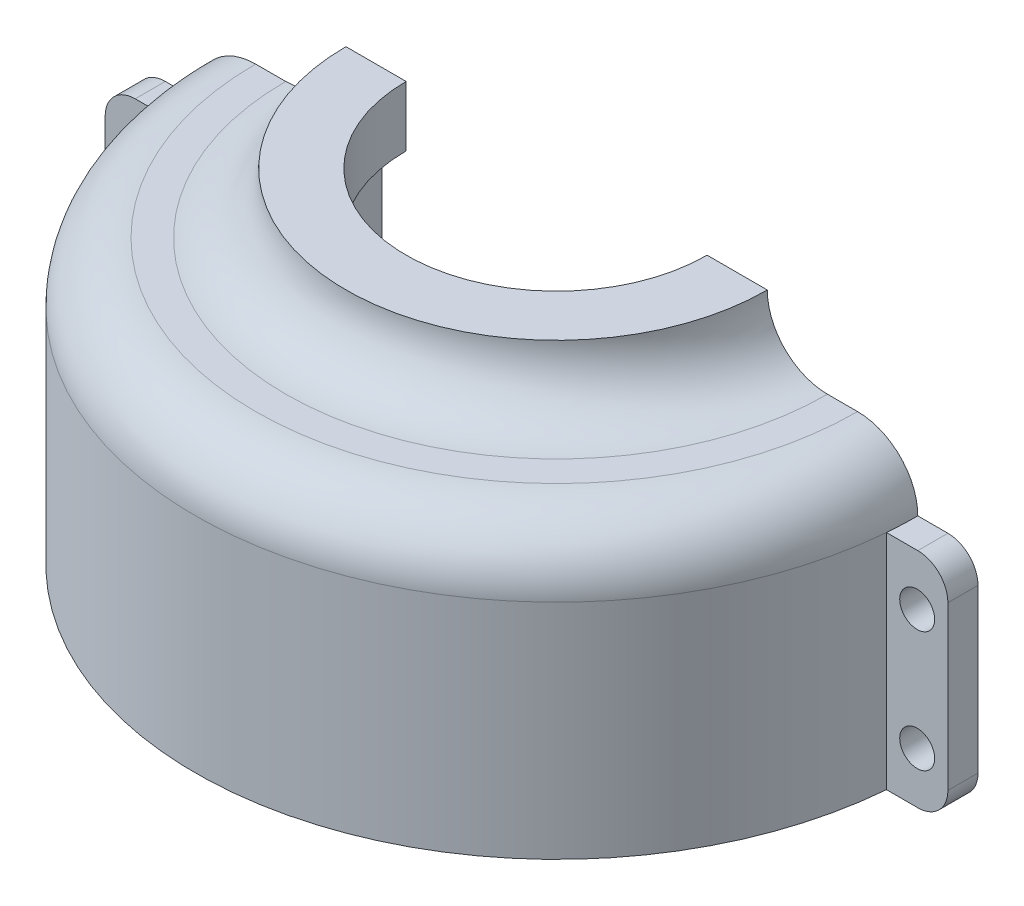
ISO-10303-21;
HEADER;
FILE_DESCRIPTION(('STEP AP214'),'2;1');
FILE_NAME('part.step','',(''),(''),'','','');
FILE_SCHEMA(('AUTOMOTIVE_DESIGN { 1 0 10303 214 1 1 1 1 }'));
ENDSEC;
DATA;
#1=APPLICATION_CONTEXT('core data for automotive mechanical design processes');
#2=APPLICATION_PROTOCOL_DEFINITION('international standard','automotive_design',2000,#1);
#3=PRODUCT_CONTEXT('',#1,'mechanical');
#4=PRODUCT('Part','Part','',(#3));
#5=PRODUCT_RELATED_PRODUCT_CATEGORY('part','',(#4));
#6=PRODUCT_DEFINITION_FORMATION('','',#4);
#7=PRODUCT_DEFINITION_CONTEXT('part definition',#1,'design');
#8=PRODUCT_DEFINITION('design','',#6,#7);
#9=PRODUCT_DEFINITION_SHAPE('','',#8);
#10=(LENGTH_UNIT() NAMED_UNIT(*) SI_UNIT(.MILLI.,.METRE.));
#11=(NAMED_UNIT(*) PLANE_ANGLE_UNIT() SI_UNIT($,.RADIAN.));
#12=(NAMED_UNIT(*) SI_UNIT($,.STERADIAN.) SOLID_ANGLE_UNIT());
#13=UNCERTAINTY_MEASURE_WITH_UNIT(LENGTH_MEASURE(1.E-05),#10,'distance_accuracy_value','');
#14=(GEOMETRIC_REPRESENTATION_CONTEXT(3) GLOBAL_UNCERTAINTY_ASSIGNED_CONTEXT((#13)) GLOBAL_UNIT_ASSIGNED_CONTEXT((#10,
#11,#12)) REPRESENTATION_CONTEXT('',''));
#15=CARTESIAN_POINT('',(0.,0.,0.));
#16=DIRECTION('',(0.,0.,1.));
#17=DIRECTION('',(1.,0.,0.));
#18=AXIS2_PLACEMENT_3D('',#15,#16,#17);
#19=CARTESIAN_POINT('',(0.,0.,0.));
#20=DIRECTION('',(0.,0.,1.));
#21=DIRECTION('',(1.,0.,0.));
#22=AXIS2_PLACEMENT_3D('',#19,#20,#21);
#23=PLANE('',#22);
#24=CARTESIAN_POINT('',(-64.8956518577535,8.49999999999998,0.));
#25=DIRECTION('',(0.,0.,1.));
#26=DIRECTION('',(1.,0.,0.));
#27=AXIS2_PLACEMENT_3D('',#24,#25,#26);
#28=CIRCLE('',#27,2.9);
#29=CARTESIAN_POINT('',(-61.9956518577535,8.49999999999998,0.));
#30=VERTEX_POINT('',#29);
#31=EDGE_CURVE('E302',#30,#30,#28,.F.);
#32=ORIENTED_EDGE('',*,*,#31,.F.);
#33=EDGE_LOOP('',(#32));
#34=FACE_BOUND('',#33,.T.);
#35=DIRECTION('',(1.,0.,0.));
#36=VECTOR('',#35,1.);
#37=CARTESIAN_POINT('',(0.,5.,0.));
#38=LINE('',#37,#36);
#39=CARTESIAN_POINT('',(-55.,5.,0.));
#40=VERTEX_POINT('',#39);
#41=CARTESIAN_POINT('',(-20.,5.,0.));
#42=VERTEX_POINT('',#41);
#43=EDGE_CURVE('E326',#40,#42,#38,.T.);
#44=ORIENTED_EDGE('',*,*,#43,.T.);
#45=DIRECTION('',(0.,-1.,0.));
#46=VECTOR('',#45,1.);
#47=CARTESIAN_POINT('',(-20.,5.,0.));
#48=LINE('',#47,#46);
#49=CARTESIAN_POINT('',(-20.,0.,0.));
#50=VERTEX_POINT('',#49);
#51=EDGE_CURVE('E344',#42,#50,#48,.T.);
#52=ORIENTED_EDGE('',*,*,#51,.T.);
#53=DIRECTION('',(1.,0.,0.));
#54=VECTOR('',#53,1.);
#55=CARTESIAN_POINT('',(0.,0.,0.));
#56=LINE('',#55,#54);
#57=CARTESIAN_POINT('',(-65.,0.,0.));
#58=VERTEX_POINT('',#57);
#59=EDGE_CURVE('E324',#58,#50,#56,.T.);
#60=ORIENTED_EDGE('',*,*,#59,.F.);
#61=CARTESIAN_POINT('',(-65.,5.,0.));
#62=DIRECTION('',(0.,0.,1.));
#63=DIRECTION('',(1.,0.,0.));
#64=AXIS2_PLACEMENT_3D('',#61,#62,#63);
#65=CIRCLE('',#64,5.);
#66=CARTESIAN_POINT('',(-70.,5.,0.));
#67=VERTEX_POINT('',#66);
#68=EDGE_CURVE('E354',#58,#67,#65,.F.);
#69=ORIENTED_EDGE('',*,*,#68,.T.);
#70=DIRECTION('',(0.,-1.,0.));
#71=VECTOR('',#70,1.);
#72=CARTESIAN_POINT('',(-70.,0.,0.));
#73=LINE('',#72,#71);
#74=CARTESIAN_POINT('',(-70.,32.,0.));
#75=VERTEX_POINT('',#74);
#76=EDGE_CURVE('E358',#75,#67,#73,.T.);
#77=ORIENTED_EDGE('',*,*,#76,.F.);
#78=CARTESIAN_POINT('',(-65.,32.,0.));
#79=DIRECTION('',(0.,0.,1.));
#80=DIRECTION('',(1.,0.,0.));
#81=AXIS2_PLACEMENT_3D('',#78,#79,#80);
#82=CIRCLE('',#81,5.);
#83=CARTESIAN_POINT('',(-65.,37.,0.));
#84=VERTEX_POINT('',#83);
#85=EDGE_CURVE('E300',#75,#84,#82,.F.);
#86=ORIENTED_EDGE('',*,*,#85,.T.);
#87=DIRECTION('',(1.,0.,0.));
#88=VECTOR('',#87,1.);
#89=CARTESIAN_POINT('',(60.001,37.,0.));
#90=LINE('',#89,#88);
#91=CARTESIAN_POINT('',(-60.,37.,0.));
#92=VERTEX_POINT('',#91);
#93=EDGE_CURVE('E355',#84,#92,#90,.T.);
#94=ORIENTED_EDGE('',*,*,#93,.T.);
#95=CARTESIAN_POINT('',(-50.,37.,0.));
#96=DIRECTION('',(0.,0.,1.));
#97=DIRECTION('',(1.,0.,0.));
#98=AXIS2_PLACEMENT_3D('',#95,#96,#97);
#99=CIRCLE('',#98,10.);
#100=CARTESIAN_POINT('',(-50.,47.,0.));
#101=VERTEX_POINT('',#100);
#102=EDGE_CURVE('E306',#92,#101,#99,.F.);
#103=ORIENTED_EDGE('',*,*,#102,.T.);
#104=DIRECTION('',(1.,0.,0.));
#105=VECTOR('',#104,1.);
#106=CARTESIAN_POINT('',(0.,47.,0.));
#107=LINE('',#106,#105);
#108=CARTESIAN_POINT('',(-45.,47.,0.));
#109=VERTEX_POINT('',#108);
#110=EDGE_CURVE('E312',#101,#109,#107,.T.);
#111=ORIENTED_EDGE('',*,*,#110,.T.);
#112=CARTESIAN_POINT('',(-45.,57.,0.));
#113=DIRECTION('',(0.,0.,1.));
#114=DIRECTION('',(1.,0.,0.));
#115=AXIS2_PLACEMENT_3D('',#112,#113,#114);
#116=CIRCLE('',#115,10.);
#117=CARTESIAN_POINT('',(-35.,57.,0.));
#118=VERTEX_POINT('',#117);
#119=EDGE_CURVE('E318',#118,#109,#116,.F.);
#120=ORIENTED_EDGE('',*,*,#119,.F.);
#121=DIRECTION('',(1.,0.,0.));
#122=VECTOR('',#121,1.);
#123=CARTESIAN_POINT('',(0.,57.,0.));
#124=LINE('',#123,#122);
#125=CARTESIAN_POINT('',(-25.,57.,0.));
#126=VERTEX_POINT('',#125);
#127=EDGE_CURVE('E323',#118,#126,#124,.T.);
#128=ORIENTED_EDGE('',*,*,#127,.T.);
#129=DIRECTION('',(0.,-1.,0.));
#130=VECTOR('',#129,1.);
#131=CARTESIAN_POINT('',(-25.,57.,0.));
#132=LINE('',#131,#130);
#133=CARTESIAN_POINT('',(-25.,47.,0.));
#134=VERTEX_POINT('',#133);
#135=EDGE_CURVE('E322',#126,#134,#132,.T.);
#136=ORIENTED_EDGE('',*,*,#135,.T.);
#137=DIRECTION('',(1.,0.,0.));
#138=VECTOR('',#137,1.);
#139=CARTESIAN_POINT('',(0.,47.,0.));
#140=LINE('',#139,#138);
#141=CARTESIAN_POINT('',(-29.,47.,0.));
#142=VERTEX_POINT('',#141);
#143=EDGE_CURVE('E330',#142,#134,#140,.T.);
#144=ORIENTED_EDGE('',*,*,#143,.F.);
#145=DIRECTION('',(0.,-1.,0.));
#146=VECTOR('',#145,1.);
#147=CARTESIAN_POINT('',(-29.,47.,0.));
#148=LINE('',#147,#146);
#149=CARTESIAN_POINT('',(-29.,22.,0.));
#150=VERTEX_POINT('',#149);
#151=EDGE_CURVE('E311',#142,#150,#148,.T.);
#152=ORIENTED_EDGE('',*,*,#151,.T.);
#153=DIRECTION('',(1.,0.,0.));
#154=VECTOR('',#153,1.);
#155=CARTESIAN_POINT('',(0.,22.,0.));
#156=LINE('',#155,#154);
#157=CARTESIAN_POINT('',(-55.,22.,0.));
#158=VERTEX_POINT('',#157);
#159=EDGE_CURVE('E336',#158,#150,#156,.T.);
#160=ORIENTED_EDGE('',*,*,#159,.F.);
#161=DIRECTION('',(0.,-1.,0.));
#162=VECTOR('',#161,1.);
#163=CARTESIAN_POINT('',(-55.,22.,0.));
#164=LINE('',#163,#162);
#165=EDGE_CURVE('E341',#158,#40,#164,.T.);
#166=ORIENTED_EDGE('',*,*,#165,.T.);
#167=EDGE_LOOP('',(#44,#52,#60,#69,#77,#86,#94,#103,#111,#120,#128,#136,#144,#152,#160,#166));
#168=FACE_BOUND('',#167,.T.);
#169=CARTESIAN_POINT('',(-64.8956518577535,28.5,0.));
#170=DIRECTION('',(0.,0.,1.));
#171=DIRECTION('',(1.,0.,0.));
#172=AXIS2_PLACEMENT_3D('',#169,#170,#171);
#173=CIRCLE('',#172,2.9);
#174=CARTESIAN_POINT('',(-61.9956518577535,28.5,0.));
#175=VERTEX_POINT('',#174);
#176=EDGE_CURVE('E37',#175,#175,#173,.F.);
#177=ORIENTED_EDGE('',*,*,#176,.F.);
#178=EDGE_LOOP('',(#177));
#179=FACE_BOUND('',#178,.T.);
#180=ADVANCED_FACE('F34',(#34,#168,#179),#23,.F.);
#181=CARTESIAN_POINT('',(64.8956518577535,8.49999999999998,0.));
#182=DIRECTION('',(0.,0.,1.));
#183=DIRECTION('',(1.,0.,0.));
#184=AXIS2_PLACEMENT_3D('',#181,#182,#183);
#185=CIRCLE('',#184,2.9);
#186=CARTESIAN_POINT('',(67.7956518577535,8.49999999999998,0.));
#187=VERTEX_POINT('',#186);
#188=EDGE_CURVE('E297',#187,#187,#185,.F.);
#189=ORIENTED_EDGE('',*,*,#188,.F.);
#190=EDGE_LOOP('',(#189));
#191=FACE_BOUND('',#190,.T.);
#192=CARTESIAN_POINT('',(20.,5.,0.));
#193=VERTEX_POINT('',#192);
#194=CARTESIAN_POINT('',(55.,5.,0.));
#195=VERTEX_POINT('',#194);
#196=EDGE_CURVE('E345',#193,#195,#38,.T.);
#197=ORIENTED_EDGE('',*,*,#196,.T.);
#198=DIRECTION('',(0.,-1.,0.));
#199=VECTOR('',#198,1.);
#200=CARTESIAN_POINT('',(55.,22.,0.));
#201=LINE('',#200,#199);
#202=CARTESIAN_POINT('',(55.,22.,0.));
#203=VERTEX_POINT('',#202);
#204=EDGE_CURVE('E338',#195,#203,#201,.F.);
#205=ORIENTED_EDGE('',*,*,#204,.T.);
#206=CARTESIAN_POINT('',(29.,22.,0.));
#207=VERTEX_POINT('',#206);
#208=EDGE_CURVE('E332',#207,#203,#156,.T.);
#209=ORIENTED_EDGE('',*,*,#208,.F.);
#210=DIRECTION('',(0.,-1.,0.));
#211=VECTOR('',#210,1.);
#212=CARTESIAN_POINT('',(29.,47.,0.));
#213=LINE('',#212,#211);
#214=CARTESIAN_POINT('',(29.,47.,0.));
#215=VERTEX_POINT('',#214);
#216=EDGE_CURVE('E333',#207,#215,#213,.F.);
#217=ORIENTED_EDGE('',*,*,#216,.T.);
#218=CARTESIAN_POINT('',(25.,47.,0.));
#219=VERTEX_POINT('',#218);
#220=EDGE_CURVE('E317',#219,#215,#140,.T.);
#221=ORIENTED_EDGE('',*,*,#220,.F.);
#222=DIRECTION('',(0.,-1.,0.));
#223=VECTOR('',#222,1.);
#224=CARTESIAN_POINT('',(25.,57.,0.));
#225=LINE('',#224,#223);
#226=CARTESIAN_POINT('',(25.,57.,0.));
#227=VERTEX_POINT('',#226);
#228=EDGE_CURVE('E307',#219,#227,#225,.F.);
#229=ORIENTED_EDGE('',*,*,#228,.T.);
#230=CARTESIAN_POINT('',(35.,57.,0.));
#231=VERTEX_POINT('',#230);
#232=EDGE_CURVE('E319',#227,#231,#124,.T.);
#233=ORIENTED_EDGE('',*,*,#232,.T.);
#234=CARTESIAN_POINT('',(45.,57.,0.));
#235=DIRECTION('',(0.,0.,1.));
#236=DIRECTION('',(1.,0.,0.));
#237=AXIS2_PLACEMENT_3D('',#234,#235,#236);
#238=CIRCLE('',#237,10.);
#239=CARTESIAN_POINT('',(45.,47.,0.));
#240=VERTEX_POINT('',#239);
#241=EDGE_CURVE('E315',#240,#231,#238,.F.);
#242=ORIENTED_EDGE('',*,*,#241,.F.);
#243=CARTESIAN_POINT('',(50.,47.,0.));
#244=VERTEX_POINT('',#243);
#245=EDGE_CURVE('E308',#240,#244,#107,.T.);
#246=ORIENTED_EDGE('',*,*,#245,.T.);
#247=CARTESIAN_POINT('',(50.,37.,0.));
#248=DIRECTION('',(0.,0.,1.));
#249=DIRECTION('',(1.,0.,0.));
#250=AXIS2_PLACEMENT_3D('',#247,#248,#249);
#251=CIRCLE('',#250,10.);
#252=CARTESIAN_POINT('',(60.,37.,0.));
#253=VERTEX_POINT('',#252);
#254=EDGE_CURVE('E304',#244,#253,#251,.F.);
#255=ORIENTED_EDGE('',*,*,#254,.T.);
#256=DIRECTION('',(1.,0.,0.));
#257=VECTOR('',#256,1.);
#258=CARTESIAN_POINT('',(-60.001,37.,0.));
#259=LINE('',#258,#257);
#260=CARTESIAN_POINT('',(65.,37.,0.));
#261=VERTEX_POINT('',#260);
#262=EDGE_CURVE('E217',#253,#261,#259,.T.);
#263=ORIENTED_EDGE('',*,*,#262,.T.);
#264=CARTESIAN_POINT('',(65.,32.,0.));
#265=DIRECTION('',(0.,0.,1.));
#266=DIRECTION('',(1.,0.,0.));
#267=AXIS2_PLACEMENT_3D('',#264,#265,#266);
#268=CIRCLE('',#267,5.);
#269=CARTESIAN_POINT('',(70.,32.,0.));
#270=VERTEX_POINT('',#269);
#271=EDGE_CURVE('E12',#261,#270,#268,.F.);
#272=ORIENTED_EDGE('',*,*,#271,.T.);
#273=DIRECTION('',(0.,1.,0.));
#274=VECTOR('',#273,1.);
#275=CARTESIAN_POINT('',(70.,0.,0.));
#276=LINE('',#275,#274);
#277=CARTESIAN_POINT('',(70.,5.,0.));
#278=VERTEX_POINT('',#277);
#279=EDGE_CURVE('E50',#278,#270,#276,.T.);
#280=ORIENTED_EDGE('',*,*,#279,.F.);
#281=CARTESIAN_POINT('',(65.,5.,0.));
#282=DIRECTION('',(0.,0.,1.));
#283=DIRECTION('',(1.,0.,0.));
#284=AXIS2_PLACEMENT_3D('',#281,#282,#283);
#285=CIRCLE('',#284,5.);
#286=CARTESIAN_POINT('',(65.,0.,0.));
#287=VERTEX_POINT('',#286);
#288=EDGE_CURVE('E42',#278,#287,#285,.F.);
#289=ORIENTED_EDGE('',*,*,#288,.T.);
#290=CARTESIAN_POINT('',(20.,0.,0.));
#291=VERTEX_POINT('',#290);
#292=EDGE_CURVE('E327',#291,#287,#56,.T.);
#293=ORIENTED_EDGE('',*,*,#292,.F.);
#294=DIRECTION('',(0.,-1.,0.));
#295=VECTOR('',#294,1.);
#296=CARTESIAN_POINT('',(20.,5.,0.));
#297=LINE('',#296,#295);
#298=EDGE_CURVE('E342',#291,#193,#297,.F.);
#299=ORIENTED_EDGE('',*,*,#298,.T.);
#300=EDGE_LOOP('',(#197,#205,#209,#217,#221,#229,#233,#242,#246,#255,#263,#272,#280,#289,#293,#299));
#301=FACE_BOUND('',#300,.T.);
#302=CARTESIAN_POINT('',(64.8956518577535,28.5,0.));
#303=DIRECTION('',(0.,0.,1.));
#304=DIRECTION('',(1.,0.,0.));
#305=AXIS2_PLACEMENT_3D('',#302,#303,#304);
#306=CIRCLE('',#305,2.9);
#307=CARTESIAN_POINT('',(67.7956518577535,28.5,0.));
#308=VERTEX_POINT('',#307);
#309=EDGE_CURVE('E303',#308,#308,#306,.F.);
#310=ORIENTED_EDGE('',*,*,#309,.F.);
#311=EDGE_LOOP('',(#310));
#312=FACE_BOUND('',#311,.T.);
#313=ADVANCED_FACE('F381',(#191,#301,#312),#23,.F.);
#314=CARTESIAN_POINT('',(0.,5.,0.));
#315=DIRECTION('',(0.,1.,0.));
#316=DIRECTION('',(0.,0.,1.));
#317=AXIS2_PLACEMENT_3D('',#314,#315,#316);
#318=PLANE('',#317);
#319=ORIENTED_EDGE('',*,*,#43,.F.);
#320=CARTESIAN_POINT('',(0.,5.,0.));
#321=DIRECTION('',(0.,1.,0.));
#322=DIRECTION('',(0.,0.,1.));
#323=AXIS2_PLACEMENT_3D('',#320,#321,#322);
#324=CIRCLE('',#323,55.);
#325=EDGE_CURVE('E274',#195,#40,#324,.F.);
#326=ORIENTED_EDGE('',*,*,#325,.F.);
#327=ORIENTED_EDGE('',*,*,#196,.F.);
#328=CARTESIAN_POINT('',(0.,5.,0.));
#329=DIRECTION('',(0.,1.,0.));
#330=DIRECTION('',(0.,0.,1.));
#331=AXIS2_PLACEMENT_3D('',#328,#329,#330);
#332=CIRCLE('',#331,20.);
#333=EDGE_CURVE('E271',#42,#193,#332,.T.);
#334=ORIENTED_EDGE('',*,*,#333,.F.);
#335=EDGE_LOOP('',(#319,#326,#327,#334));
#336=FACE_BOUND('',#335,.T.);
#337=ADVANCED_FACE('F386',(#336),#318,.T.);
#338=CARTESIAN_POINT('',(0.,0.,0.));
#339=DIRECTION('',(0.,1.,0.));
#340=DIRECTION('',(0.,0.,1.));
#341=AXIS2_PLACEMENT_3D('',#338,#339,#340);
#342=PLANE('',#341);
#343=DIRECTION('',(0.,0.,1.));
#344=VECTOR('',#343,1.);
#345=CARTESIAN_POINT('',(-65.,0.,0.));
#346=LINE('',#345,#344);
#347=CARTESIAN_POINT('',(-65.,0.,5.));
#348=VERTEX_POINT('',#347);
#349=EDGE_CURVE('E293',#348,#58,#346,.F.);
#350=ORIENTED_EDGE('',*,*,#349,.T.);
#351=ORIENTED_EDGE('',*,*,#59,.T.);
#352=CARTESIAN_POINT('',(0.,0.,0.));
#353=DIRECTION('',(0.,1.,0.));
#354=DIRECTION('',(0.,0.,1.));
#355=AXIS2_PLACEMENT_3D('',#352,#353,#354);
#356=CIRCLE('',#355,20.);
#357=EDGE_CURVE('E270',#50,#291,#356,.T.);
#358=ORIENTED_EDGE('',*,*,#357,.T.);
#359=ORIENTED_EDGE('',*,*,#292,.T.);
#360=DIRECTION('',(0.,0.,1.));
#361=VECTOR('',#360,1.);
#362=CARTESIAN_POINT('',(65.,0.,0.));
#363=LINE('',#362,#361);
#364=CARTESIAN_POINT('',(65.,0.,5.));
#365=VERTEX_POINT('',#364);
#366=EDGE_CURVE('E229',#365,#287,#363,.F.);
#367=ORIENTED_EDGE('',*,*,#366,.F.);
#368=DIRECTION('',(1.,0.,0.));
#369=VECTOR('',#368,1.);
#370=CARTESIAN_POINT('',(-60.001,0.,5.));
#371=LINE('',#370,#369);
#372=CARTESIAN_POINT('',(59.791303715507,0.,5.));
#373=VERTEX_POINT('',#372);
#374=EDGE_CURVE('E204',#373,#365,#371,.T.);
#375=ORIENTED_EDGE('',*,*,#374,.F.);
#376=CARTESIAN_POINT('',(0.,0.,0.));
#377=DIRECTION('',(0.,1.,0.));
#378=DIRECTION('',(0.,0.,1.));
#379=AXIS2_PLACEMENT_3D('',#376,#377,#378);
#380=CIRCLE('',#379,60.);
#381=CARTESIAN_POINT('',(-59.791303715507,0.,5.));
#382=VERTEX_POINT('',#381);
#383=EDGE_CURVE('E200',#382,#373,#380,.T.);
#384=ORIENTED_EDGE('',*,*,#383,.F.);
#385=DIRECTION('',(-1.,0.,0.));
#386=VECTOR('',#385,1.);
#387=CARTESIAN_POINT('',(60.001,0.,5.));
#388=LINE('',#387,#386);
#389=EDGE_CURVE('E244',#382,#348,#388,.T.);
#390=ORIENTED_EDGE('',*,*,#389,.T.);
#391=EDGE_LOOP('',(#350,#351,#358,#359,#367,#375,#384,#390));
#392=FACE_BOUND('',#391,.T.);
#393=ADVANCED_FACE('F403',(#392),#342,.F.);
#394=CARTESIAN_POINT('',(0.,5.,0.));
#395=DIRECTION('',(0.,-1.,0.));
#396=DIRECTION('',(0.,0.,-1.));
#397=AXIS2_PLACEMENT_3D('',#394,#395,#396);
#398=CYLINDRICAL_SURFACE('',#397,20.);
#399=ORIENTED_EDGE('',*,*,#51,.F.);
#400=ORIENTED_EDGE('',*,*,#333,.T.);
#401=ORIENTED_EDGE('',*,*,#298,.F.);
#402=ORIENTED_EDGE('',*,*,#357,.F.);
#403=EDGE_LOOP('',(#399,#400,#401,#402));
#404=FACE_BOUND('',#403,.T.);
#405=ADVANCED_FACE('F400',(#404),#398,.F.);
#406=CARTESIAN_POINT('',(0.,0.,0.));
#407=DIRECTION('',(0.,1.,0.));
#408=DIRECTION('',(0.,0.,1.));
#409=AXIS2_PLACEMENT_3D('',#406,#407,#408);
#410=CYLINDRICAL_SURFACE('',#409,60.);
#411=DIRECTION('',(0.,1.,0.));
#412=VECTOR('',#411,1.);
#413=CARTESIAN_POINT('',(59.791303715507,0.,5.));
#414=LINE('',#413,#412);
#415=CARTESIAN_POINT('',(59.791303715507,37.,5.));
#416=VERTEX_POINT('',#415);
#417=EDGE_CURVE('E196',#416,#373,#414,.F.);
#418=ORIENTED_EDGE('',*,*,#417,.F.);
#419=CARTESIAN_POINT('',(0.,37.,0.));
#420=DIRECTION('',(0.,1.,0.));
#421=DIRECTION('',(0.,0.,1.));
#422=AXIS2_PLACEMENT_3D('',#419,#420,#421);
#423=CIRCLE('',#422,60.);
#424=CARTESIAN_POINT('',(-59.791303715507,37.,5.));
#425=VERTEX_POINT('',#424);
#426=EDGE_CURVE('E184',#416,#425,#423,.F.);
#427=ORIENTED_EDGE('',*,*,#426,.T.);
#428=DIRECTION('',(0.,1.,0.));
#429=VECTOR('',#428,1.);
#430=CARTESIAN_POINT('',(-59.791303715507,0.,5.));
#431=LINE('',#430,#429);
#432=EDGE_CURVE('E241',#425,#382,#431,.F.);
#433=ORIENTED_EDGE('',*,*,#432,.T.);
#434=ORIENTED_EDGE('',*,*,#383,.T.);
#435=EDGE_LOOP('',(#418,#427,#433,#434));
#436=FACE_BOUND('',#435,.T.);
#437=ADVANCED_FACE('F198',(#436),#410,.T.);
#438=CARTESIAN_POINT('',(0.,22.,0.));
#439=DIRECTION('',(0.,-1.,0.));
#440=DIRECTION('',(0.,0.,-1.));
#441=AXIS2_PLACEMENT_3D('',#438,#439,#440);
#442=CYLINDRICAL_SURFACE('',#441,55.);
#443=ORIENTED_EDGE('',*,*,#165,.F.);
#444=CARTESIAN_POINT('',(0.,22.,0.));
#445=DIRECTION('',(0.,1.,0.));
#446=DIRECTION('',(0.,0.,1.));
#447=AXIS2_PLACEMENT_3D('',#444,#445,#446);
#448=CIRCLE('',#447,55.);
#449=EDGE_CURVE('E266',#158,#203,#448,.T.);
#450=ORIENTED_EDGE('',*,*,#449,.T.);
#451=ORIENTED_EDGE('',*,*,#204,.F.);
#452=ORIENTED_EDGE('',*,*,#325,.T.);
#453=EDGE_LOOP('',(#443,#450,#451,#452));
#454=FACE_BOUND('',#453,.T.);
#455=ADVANCED_FACE('F499',(#454),#442,.F.);
#456=CARTESIAN_POINT('',(0.,22.,0.));
#457=DIRECTION('',(0.,1.,0.));
#458=DIRECTION('',(0.,0.,1.));
#459=AXIS2_PLACEMENT_3D('',#456,#457,#458);
#460=PLANE('',#459);
#461=ORIENTED_EDGE('',*,*,#449,.F.);
#462=ORIENTED_EDGE('',*,*,#159,.T.);
#463=CARTESIAN_POINT('',(0.,22.,0.));
#464=DIRECTION('',(0.,1.,0.));
#465=DIRECTION('',(0.,0.,1.));
#466=AXIS2_PLACEMENT_3D('',#463,#464,#465);
#467=CIRCLE('',#466,29.);
#468=EDGE_CURVE('E263',#150,#207,#467,.T.);
#469=ORIENTED_EDGE('',*,*,#468,.T.);
#470=ORIENTED_EDGE('',*,*,#208,.T.);
#471=EDGE_LOOP('',(#461,#462,#469,#470));
#472=FACE_BOUND('',#471,.T.);
#473=ADVANCED_FACE('F495',(#472),#460,.F.);
#474=CARTESIAN_POINT('',(0.,47.,0.));
#475=DIRECTION('',(0.,1.,0.));
#476=DIRECTION('',(0.,0.,1.));
#477=AXIS2_PLACEMENT_3D('',#474,#475,#476);
#478=PLANE('',#477);
#479=ORIENTED_EDGE('',*,*,#110,.F.);
#480=CARTESIAN_POINT('',(0.,47.,0.));
#481=DIRECTION('',(0.,1.,0.));
#482=DIRECTION('',(0.,0.,1.));
#483=AXIS2_PLACEMENT_3D('',#480,#481,#482);
#484=CIRCLE('',#483,50.);
#485=EDGE_CURVE('E279',#101,#244,#484,.T.);
#486=ORIENTED_EDGE('',*,*,#485,.T.);
#487=ORIENTED_EDGE('',*,*,#245,.F.);
#488=CARTESIAN_POINT('',(0.,47.,0.));
#489=DIRECTION('',(0.,1.,0.));
#490=DIRECTION('',(0.,0.,1.));
#491=AXIS2_PLACEMENT_3D('',#488,#489,#490);
#492=CIRCLE('',#491,45.);
#493=EDGE_CURVE('E193',#240,#109,#492,.F.);
#494=ORIENTED_EDGE('',*,*,#493,.T.);
#495=EDGE_LOOP('',(#479,#486,#487,#494));
#496=FACE_BOUND('',#495,.T.);
#497=ADVANCED_FACE('F491',(#496),#478,.T.);
#498=CARTESIAN_POINT('',(0.,47.,0.));
#499=DIRECTION('',(0.,-1.,0.));
#500=DIRECTION('',(0.,0.,-1.));
#501=AXIS2_PLACEMENT_3D('',#498,#499,#500);
#502=CYLINDRICAL_SURFACE('',#501,29.);
#503=ORIENTED_EDGE('',*,*,#151,.F.);
#504=CARTESIAN_POINT('',(0.,47.,0.));
#505=DIRECTION('',(0.,1.,0.));
#506=DIRECTION('',(0.,0.,1.));
#507=AXIS2_PLACEMENT_3D('',#504,#505,#506);
#508=CIRCLE('',#507,29.);
#509=EDGE_CURVE('E260',#142,#215,#508,.T.);
#510=ORIENTED_EDGE('',*,*,#509,.T.);
#511=ORIENTED_EDGE('',*,*,#216,.F.);
#512=ORIENTED_EDGE('',*,*,#468,.F.);
#513=EDGE_LOOP('',(#503,#510,#511,#512));
#514=FACE_BOUND('',#513,.T.);
#515=ADVANCED_FACE('F487',(#514),#502,.F.);
#516=CARTESIAN_POINT('',(0.,47.,0.));
#517=DIRECTION('',(0.,1.,0.));
#518=DIRECTION('',(0.,0.,1.));
#519=AXIS2_PLACEMENT_3D('',#516,#517,#518);
#520=PLANE('',#519);
#521=ORIENTED_EDGE('',*,*,#509,.F.);
#522=ORIENTED_EDGE('',*,*,#143,.T.);
#523=CARTESIAN_POINT('',(0.,47.,0.));
#524=DIRECTION('',(0.,1.,0.));
#525=DIRECTION('',(0.,0.,1.));
#526=AXIS2_PLACEMENT_3D('',#523,#524,#525);
#527=CIRCLE('',#526,25.);
#528=EDGE_CURVE('E243',#134,#219,#527,.T.);
#529=ORIENTED_EDGE('',*,*,#528,.T.);
#530=ORIENTED_EDGE('',*,*,#220,.T.);
#531=EDGE_LOOP('',(#521,#522,#529,#530));
#532=FACE_BOUND('',#531,.T.);
#533=ADVANCED_FACE('F483',(#532),#520,.F.);
#534=CARTESIAN_POINT('',(0.,57.,0.));
#535=DIRECTION('',(0.,1.,0.));
#536=DIRECTION('',(0.,0.,1.));
#537=AXIS2_PLACEMENT_3D('',#534,#535,#536);
#538=PLANE('',#537);
#539=ORIENTED_EDGE('',*,*,#127,.F.);
#540=CARTESIAN_POINT('',(0.,57.,0.));
#541=DIRECTION('',(0.,1.,0.));
#542=DIRECTION('',(0.,0.,1.));
#543=AXIS2_PLACEMENT_3D('',#540,#541,#542);
#544=CIRCLE('',#543,35.);
#545=EDGE_CURVE('E255',#118,#231,#544,.T.);
#546=ORIENTED_EDGE('',*,*,#545,.T.);
#547=ORIENTED_EDGE('',*,*,#232,.F.);
#548=CARTESIAN_POINT('',(0.,57.,0.));
#549=DIRECTION('',(0.,1.,0.));
#550=DIRECTION('',(0.,0.,1.));
#551=AXIS2_PLACEMENT_3D('',#548,#549,#550);
#552=CIRCLE('',#551,25.);
#553=EDGE_CURVE('E252',#126,#227,#552,.T.);
#554=ORIENTED_EDGE('',*,*,#553,.F.);
#555=EDGE_LOOP('',(#539,#546,#547,#554));
#556=FACE_BOUND('',#555,.T.);
#557=ADVANCED_FACE('F479',(#556),#538,.T.);
#558=CARTESIAN_POINT('',(0.,57.,0.));
#559=DIRECTION('',(0.,-1.,0.));
#560=DIRECTION('',(0.,0.,-1.));
#561=AXIS2_PLACEMENT_3D('',#558,#559,#560);
#562=CYLINDRICAL_SURFACE('',#561,25.);
#563=ORIENTED_EDGE('',*,*,#135,.F.);
#564=ORIENTED_EDGE('',*,*,#553,.T.);
#565=ORIENTED_EDGE('',*,*,#228,.F.);
#566=ORIENTED_EDGE('',*,*,#528,.F.);
#567=EDGE_LOOP('',(#563,#564,#565,#566));
#568=FACE_BOUND('',#567,.T.);
#569=ADVANCED_FACE('F475',(#568),#562,.F.);
#570=CARTESIAN_POINT('',(0.,57.,0.));
#571=DIRECTION('',(0.,1.,0.));
#572=DIRECTION('',(0.,0.,1.));
#573=AXIS2_PLACEMENT_3D('',#570,#571,#572);
#574=TOROIDAL_SURFACE('',#573,45.,10.);
#575=ORIENTED_EDGE('',*,*,#493,.F.);
#576=ORIENTED_EDGE('',*,*,#241,.T.);
#577=ORIENTED_EDGE('',*,*,#545,.F.);
#578=ORIENTED_EDGE('',*,*,#119,.T.);
#579=EDGE_LOOP('',(#575,#576,#577,#578));
#580=FACE_BOUND('',#579,.T.);
#581=ADVANCED_FACE('F478',(#580),#574,.F.);
#582=CARTESIAN_POINT('',(0.,37.,0.));
#583=DIRECTION('',(0.,1.,0.));
#584=DIRECTION('',(0.,0.,1.));
#585=AXIS2_PLACEMENT_3D('',#582,#583,#584);
#586=TOROIDAL_SURFACE('',#585,50.,10.);
#587=ORIENTED_EDGE('',*,*,#254,.F.);
#588=ORIENTED_EDGE('',*,*,#485,.F.);
#589=ORIENTED_EDGE('',*,*,#102,.F.);
#590=EDGE_CURVE('E190',#425,#92,#423,.F.);
#591=ORIENTED_EDGE('',*,*,#590,.F.);
#592=ORIENTED_EDGE('',*,*,#426,.F.);
#593=CARTESIAN_POINT('',(0.,37.,0.));
#594=DIRECTION('',(0.,-1.,0.));
#595=DIRECTION('',(0.,0.,1.));
#596=AXIS2_PLACEMENT_3D('',#593,#594,#595);
#597=CIRCLE('',#596,60.);
#598=EDGE_CURVE('E188',#416,#253,#597,.F.);
#599=ORIENTED_EDGE('',*,*,#598,.T.);
#600=EDGE_LOOP('',(#587,#588,#589,#591,#592,#599));
#601=FACE_BOUND('',#600,.T.);
#602=ADVANCED_FACE('F186',(#601),#586,.T.);
#603=CARTESIAN_POINT('',(-70.,0.,0.));
#604=DIRECTION('',(1.,0.,0.));
#605=DIRECTION('',(0.,0.,-1.));
#606=AXIS2_PLACEMENT_3D('',#603,#604,#605);
#607=PLANE('',#606);
#608=DIRECTION('',(0.,0.,-1.));
#609=VECTOR('',#608,1.);
#610=CARTESIAN_POINT('',(-70.,32.,-5.));
#611=LINE('',#610,#609);
#612=CARTESIAN_POINT('',(-70.,32.,5.));
#613=VERTEX_POINT('',#612);
#614=EDGE_CURVE('E284',#613,#75,#611,.T.);
#615=ORIENTED_EDGE('',*,*,#614,.T.);
#616=ORIENTED_EDGE('',*,*,#76,.T.);
#617=DIRECTION('',(0.,0.,1.));
#618=VECTOR('',#617,1.);
#619=CARTESIAN_POINT('',(-70.,5.,0.));
#620=LINE('',#619,#618);
#621=CARTESIAN_POINT('',(-70.,5.,5.));
#622=VERTEX_POINT('',#621);
#623=EDGE_CURVE('E287',#67,#622,#620,.T.);
#624=ORIENTED_EDGE('',*,*,#623,.T.);
#625=DIRECTION('',(0.,1.,0.));
#626=VECTOR('',#625,1.);
#627=CARTESIAN_POINT('',(-70.,37.,5.));
#628=LINE('',#627,#626);
#629=EDGE_CURVE('E240',#622,#613,#628,.T.);
#630=ORIENTED_EDGE('',*,*,#629,.T.);
#631=EDGE_LOOP('',(#615,#616,#624,#630));
#632=FACE_BOUND('',#631,.T.);
#633=ADVANCED_FACE('F413',(#632),#607,.F.);
#634=CARTESIAN_POINT('',(60.001,37.,5.));
#635=DIRECTION('',(0.,1.,0.));
#636=DIRECTION('',(0.,0.,1.));
#637=AXIS2_PLACEMENT_3D('',#634,#635,#636);
#638=PLANE('',#637);
#639=ORIENTED_EDGE('',*,*,#93,.F.);
#640=DIRECTION('',(0.,0.,-1.));
#641=VECTOR('',#640,1.);
#642=CARTESIAN_POINT('',(-65.,37.,5.));
#643=LINE('',#642,#641);
#644=CARTESIAN_POINT('',(-65.,37.,5.));
#645=VERTEX_POINT('',#644);
#646=EDGE_CURVE('E296',#84,#645,#643,.F.);
#647=ORIENTED_EDGE('',*,*,#646,.T.);
#648=DIRECTION('',(-1.,0.,0.));
#649=VECTOR('',#648,1.);
#650=CARTESIAN_POINT('',(60.001,37.,5.));
#651=LINE('',#650,#649);
#652=EDGE_CURVE('E247',#425,#645,#651,.T.);
#653=ORIENTED_EDGE('',*,*,#652,.F.);
#654=ORIENTED_EDGE('',*,*,#590,.T.);
#655=EDGE_LOOP('',(#639,#647,#653,#654));
#656=FACE_BOUND('',#655,.T.);
#657=ADVANCED_FACE('F423',(#656),#638,.T.);
#658=CARTESIAN_POINT('',(60.001,37.,5.));
#659=DIRECTION('',(0.,0.,1.));
#660=DIRECTION('',(0.,-1.,0.));
#661=AXIS2_PLACEMENT_3D('',#658,#659,#660);
#662=PLANE('',#661);
#663=CARTESIAN_POINT('',(-64.8956518577535,8.49999999999998,5.));
#664=DIRECTION('',(0.,0.,1.));
#665=DIRECTION('',(1.,0.,0.));
#666=AXIS2_PLACEMENT_3D('',#663,#664,#665);
#667=CIRCLE('',#666,2.9);
#668=CARTESIAN_POINT('',(-61.9956518577535,8.49999999999998,5.));
#669=VERTEX_POINT('',#668);
#670=EDGE_CURVE('E234',#669,#669,#667,.T.);
#671=ORIENTED_EDGE('',*,*,#670,.F.);
#672=EDGE_LOOP('',(#671));
#673=FACE_BOUND('',#672,.T.);
#674=CARTESIAN_POINT('',(-64.8956518577535,28.5,5.));
#675=DIRECTION('',(0.,0.,1.));
#676=DIRECTION('',(1.,0.,0.));
#677=AXIS2_PLACEMENT_3D('',#674,#675,#676);
#678=CIRCLE('',#677,2.9);
#679=CARTESIAN_POINT('',(-61.9956518577535,28.5,5.));
#680=VERTEX_POINT('',#679);
#681=EDGE_CURVE('E237',#680,#680,#678,.T.);
#682=ORIENTED_EDGE('',*,*,#681,.F.);
#683=EDGE_LOOP('',(#682));
#684=FACE_BOUND('',#683,.T.);
#685=ORIENTED_EDGE('',*,*,#629,.F.);
#686=CARTESIAN_POINT('',(-65.,5.,5.));
#687=DIRECTION('',(0.,0.,1.));
#688=DIRECTION('',(0.,-1.,0.));
#689=AXIS2_PLACEMENT_3D('',#686,#687,#688);
#690=CIRCLE('',#689,5.);
#691=EDGE_CURVE('E291',#622,#348,#690,.T.);
#692=ORIENTED_EDGE('',*,*,#691,.T.);
#693=ORIENTED_EDGE('',*,*,#389,.F.);
#694=ORIENTED_EDGE('',*,*,#432,.F.);
#695=ORIENTED_EDGE('',*,*,#652,.T.);
#696=CARTESIAN_POINT('',(-65.,32.,5.));
#697=DIRECTION('',(0.,0.,1.));
#698=DIRECTION('',(0.,-1.,0.));
#699=AXIS2_PLACEMENT_3D('',#696,#697,#698);
#700=CIRCLE('',#699,5.);
#701=EDGE_CURVE('E289',#645,#613,#700,.T.);
#702=ORIENTED_EDGE('',*,*,#701,.T.);
#703=EDGE_LOOP('',(#685,#692,#693,#694,#695,#702));
#704=FACE_BOUND('',#703,.T.);
#705=ADVANCED_FACE('F425',(#673,#684,#704),#662,.T.);
#706=CARTESIAN_POINT('',(-64.8956518577535,28.5,5.));
#707=DIRECTION('',(0.,0.,1.));
#708=DIRECTION('',(1.,0.,0.));
#709=AXIS2_PLACEMENT_3D('',#706,#707,#708);
#710=CYLINDRICAL_SURFACE('',#709,2.9);
#711=ORIENTED_EDGE('',*,*,#176,.T.);
#712=EDGE_LOOP('',(#711));
#713=FACE_BOUND('',#712,.T.);
#714=ORIENTED_EDGE('',*,*,#681,.T.);
#715=EDGE_LOOP('',(#714));
#716=FACE_BOUND('',#715,.T.);
#717=ADVANCED_FACE('F377',(#713,#716),#710,.F.);
#718=CARTESIAN_POINT('',(-64.8956518577535,8.49999999999998,5.));
#719=DIRECTION('',(0.,0.,1.));
#720=DIRECTION('',(1.,0.,0.));
#721=AXIS2_PLACEMENT_3D('',#718,#719,#720);
#722=CYLINDRICAL_SURFACE('',#721,2.9);
#723=ORIENTED_EDGE('',*,*,#31,.T.);
#724=EDGE_LOOP('',(#723));
#725=FACE_BOUND('',#724,.T.);
#726=ORIENTED_EDGE('',*,*,#670,.T.);
#727=EDGE_LOOP('',(#726));
#728=FACE_BOUND('',#727,.T.);
#729=ADVANCED_FACE('F463',(#725,#728),#722,.F.);
#730=CARTESIAN_POINT('',(-65.,5.,0.));
#731=DIRECTION('',(0.,0.,1.));
#732=DIRECTION('',(1.,0.,0.));
#733=AXIS2_PLACEMENT_3D('',#730,#731,#732);
#734=CYLINDRICAL_SURFACE('',#733,5.);
#735=ORIENTED_EDGE('',*,*,#68,.F.);
#736=ORIENTED_EDGE('',*,*,#349,.F.);
#737=ORIENTED_EDGE('',*,*,#691,.F.);
#738=ORIENTED_EDGE('',*,*,#623,.F.);
#739=EDGE_LOOP('',(#735,#736,#737,#738));
#740=FACE_BOUND('',#739,.T.);
#741=ADVANCED_FACE('F410',(#740),#734,.T.);
#742=CARTESIAN_POINT('',(-65.,32.,0.));
#743=DIRECTION('',(0.,0.,1.));
#744=DIRECTION('',(1.,0.,0.));
#745=AXIS2_PLACEMENT_3D('',#742,#743,#744);
#746=CYLINDRICAL_SURFACE('',#745,5.);
#747=ORIENTED_EDGE('',*,*,#85,.F.);
#748=ORIENTED_EDGE('',*,*,#614,.F.);
#749=ORIENTED_EDGE('',*,*,#701,.F.);
#750=ORIENTED_EDGE('',*,*,#646,.F.);
#751=EDGE_LOOP('',(#747,#748,#749,#750));
#752=FACE_BOUND('',#751,.T.);
#753=ADVANCED_FACE('F417',(#752),#746,.T.);
#754=CARTESIAN_POINT('',(70.,0.,0.));
#755=DIRECTION('',(-1.,0.,0.));
#756=DIRECTION('',(0.,0.,-1.));
#757=AXIS2_PLACEMENT_3D('',#754,#755,#756);
#758=PLANE('',#757);
#759=DIRECTION('',(0.,0.,1.));
#760=VECTOR('',#759,1.);
#761=CARTESIAN_POINT('',(70.,5.,0.));
#762=LINE('',#761,#760);
#763=CARTESIAN_POINT('',(70.,5.,5.));
#764=VERTEX_POINT('',#763);
#765=EDGE_CURVE('E221',#278,#764,#762,.T.);
#766=ORIENTED_EDGE('',*,*,#765,.F.);
#767=ORIENTED_EDGE('',*,*,#279,.T.);
#768=DIRECTION('',(0.,0.,-1.));
#769=VECTOR('',#768,1.);
#770=CARTESIAN_POINT('',(70.,32.,-5.));
#771=LINE('',#770,#769);
#772=CARTESIAN_POINT('',(70.,32.,5.));
#773=VERTEX_POINT('',#772);
#774=EDGE_CURVE('E219',#773,#270,#771,.T.);
#775=ORIENTED_EDGE('',*,*,#774,.F.);
#776=DIRECTION('',(0.,1.,0.));
#777=VECTOR('',#776,1.);
#778=CARTESIAN_POINT('',(70.,37.,5.));
#779=LINE('',#778,#777);
#780=EDGE_CURVE('E214',#764,#773,#779,.T.);
#781=ORIENTED_EDGE('',*,*,#780,.F.);
#782=EDGE_LOOP('',(#766,#767,#775,#781));
#783=FACE_BOUND('',#782,.T.);
#784=ADVANCED_FACE('F454',(#783),#758,.F.);
#785=CARTESIAN_POINT('',(-60.001,37.,5.));
#786=DIRECTION('',(0.,1.,0.));
#787=DIRECTION('',(0.,0.,1.));
#788=AXIS2_PLACEMENT_3D('',#785,#786,#787);
#789=PLANE('',#788);
#790=ORIENTED_EDGE('',*,*,#262,.F.);
#791=ORIENTED_EDGE('',*,*,#598,.F.);
#792=DIRECTION('',(1.,0.,0.));
#793=VECTOR('',#792,1.);
#794=CARTESIAN_POINT('',(-60.001,37.,5.));
#795=LINE('',#794,#793);
#796=CARTESIAN_POINT('',(65.,37.,5.));
#797=VERTEX_POINT('',#796);
#798=EDGE_CURVE('E208',#416,#797,#795,.T.);
#799=ORIENTED_EDGE('',*,*,#798,.T.);
#800=DIRECTION('',(0.,0.,-1.));
#801=VECTOR('',#800,1.);
#802=CARTESIAN_POINT('',(65.,37.,5.));
#803=LINE('',#802,#801);
#804=EDGE_CURVE('E232',#261,#797,#803,.F.);
#805=ORIENTED_EDGE('',*,*,#804,.F.);
#806=EDGE_LOOP('',(#790,#791,#799,#805));
#807=FACE_BOUND('',#806,.T.);
#808=ADVANCED_FACE('F216',(#807),#789,.T.);
#809=CARTESIAN_POINT('',(-60.001,37.,5.));
#810=DIRECTION('',(0.,0.,1.));
#811=DIRECTION('',(0.,-1.,0.));
#812=AXIS2_PLACEMENT_3D('',#809,#810,#811);
#813=PLANE('',#812);
#814=CARTESIAN_POINT('',(64.8956518577535,8.49999999999998,5.));
#815=DIRECTION('',(0.,0.,-1.));
#816=DIRECTION('',(-1.,0.,0.));
#817=AXIS2_PLACEMENT_3D('',#814,#815,#816);
#818=CIRCLE('',#817,2.9);
#819=CARTESIAN_POINT('',(61.9956518577535,8.49999999999998,5.));
#820=VERTEX_POINT('',#819);
#821=EDGE_CURVE('E433',#820,#820,#818,.T.);
#822=ORIENTED_EDGE('',*,*,#821,.T.);
#823=EDGE_LOOP('',(#822));
#824=FACE_BOUND('',#823,.T.);
#825=CARTESIAN_POINT('',(64.8956518577535,28.5,5.));
#826=DIRECTION('',(0.,0.,-1.));
#827=DIRECTION('',(-1.,0.,0.));
#828=AXIS2_PLACEMENT_3D('',#825,#826,#827);
#829=CIRCLE('',#828,2.9);
#830=CARTESIAN_POINT('',(61.9956518577535,28.5,5.));
#831=VERTEX_POINT('',#830);
#832=EDGE_CURVE('E429',#831,#831,#829,.T.);
#833=ORIENTED_EDGE('',*,*,#832,.T.);
#834=EDGE_LOOP('',(#833));
#835=FACE_BOUND('',#834,.T.);
#836=ORIENTED_EDGE('',*,*,#780,.T.);
#837=CARTESIAN_POINT('',(65.,32.,5.));
#838=DIRECTION('',(0.,0.,-1.));
#839=DIRECTION('',(0.,-1.,0.));
#840=AXIS2_PLACEMENT_3D('',#837,#838,#839);
#841=CIRCLE('',#840,5.);
#842=EDGE_CURVE('E211',#797,#773,#841,.T.);
#843=ORIENTED_EDGE('',*,*,#842,.F.);
#844=ORIENTED_EDGE('',*,*,#798,.F.);
#845=ORIENTED_EDGE('',*,*,#417,.T.);
#846=ORIENTED_EDGE('',*,*,#374,.T.);
#847=CARTESIAN_POINT('',(65.,5.,5.));
#848=DIRECTION('',(0.,0.,-1.));
#849=DIRECTION('',(0.,-1.,0.));
#850=AXIS2_PLACEMENT_3D('',#847,#848,#849);
#851=CIRCLE('',#850,5.);
#852=EDGE_CURVE('E227',#764,#365,#851,.T.);
#853=ORIENTED_EDGE('',*,*,#852,.F.);
#854=EDGE_LOOP('',(#836,#843,#844,#845,#846,#853));
#855=FACE_BOUND('',#854,.T.);
#856=ADVANCED_FACE('F210',(#824,#835,#855),#813,.T.);
#857=CARTESIAN_POINT('',(64.8956518577535,28.5,5.));
#858=DIRECTION('',(0.,0.,1.));
#859=DIRECTION('',(-1.,0.,0.));
#860=AXIS2_PLACEMENT_3D('',#857,#858,#859);
#861=CYLINDRICAL_SURFACE('',#860,2.9);
#862=ORIENTED_EDGE('',*,*,#309,.T.);
#863=EDGE_LOOP('',(#862));
#864=FACE_BOUND('',#863,.T.);
#865=ORIENTED_EDGE('',*,*,#832,.F.);
#866=EDGE_LOOP('',(#865));
#867=FACE_BOUND('',#866,.T.);
#868=ADVANCED_FACE('F442',(#864,#867),#861,.F.);
#869=CARTESIAN_POINT('',(64.8956518577535,8.49999999999998,5.));
#870=DIRECTION('',(0.,0.,1.));
#871=DIRECTION('',(-1.,0.,0.));
#872=AXIS2_PLACEMENT_3D('',#869,#870,#871);
#873=CYLINDRICAL_SURFACE('',#872,2.9);
#874=ORIENTED_EDGE('',*,*,#188,.T.);
#875=EDGE_LOOP('',(#874));
#876=FACE_BOUND('',#875,.T.);
#877=ORIENTED_EDGE('',*,*,#821,.F.);
#878=EDGE_LOOP('',(#877));
#879=FACE_BOUND('',#878,.T.);
#880=ADVANCED_FACE('F439',(#876,#879),#873,.F.);
#881=CARTESIAN_POINT('',(65.,5.,0.));
#882=DIRECTION('',(0.,0.,1.));
#883=DIRECTION('',(-1.,0.,0.));
#884=AXIS2_PLACEMENT_3D('',#881,#882,#883);
#885=CYLINDRICAL_SURFACE('',#884,5.);
#886=ORIENTED_EDGE('',*,*,#288,.F.);
#887=ORIENTED_EDGE('',*,*,#765,.T.);
#888=ORIENTED_EDGE('',*,*,#852,.T.);
#889=ORIENTED_EDGE('',*,*,#366,.T.);
#890=EDGE_LOOP('',(#886,#887,#888,#889));
#891=FACE_BOUND('',#890,.T.);
#892=ADVANCED_FACE('F441',(#891),#885,.T.);
#893=CARTESIAN_POINT('',(65.,32.,0.));
#894=DIRECTION('',(0.,0.,1.));
#895=DIRECTION('',(-1.,0.,0.));
#896=AXIS2_PLACEMENT_3D('',#893,#894,#895);
#897=CYLINDRICAL_SURFACE('',#896,5.);
#898=ORIENTED_EDGE('',*,*,#271,.F.);
#899=ORIENTED_EDGE('',*,*,#804,.T.);
#900=ORIENTED_EDGE('',*,*,#842,.T.);
#901=ORIENTED_EDGE('',*,*,#774,.T.);
#902=EDGE_LOOP('',(#898,#899,#900,#901));
#903=FACE_BOUND('',#902,.T.);
#904=ADVANCED_FACE('F388',(#903),#897,.T.);
#905=CLOSED_SHELL('',(#180,#313,#337,#393,#405,#437,#455,#473,#497,#515,#533,#557,#569,#581,
#602,#633,#657,#705,#717,#729,#741,#753,#784,#808,#856,#868,#880,#892,#904));
#906=MANIFOLD_SOLID_BREP('B2',#905);
#907=ADVANCED_BREP_SHAPE_REPRESENTATION('',(#18,#906),#14);
#908=SHAPE_DEFINITION_REPRESENTATION(#9,#907);
ENDSEC;
END-ISO-10303-21;
